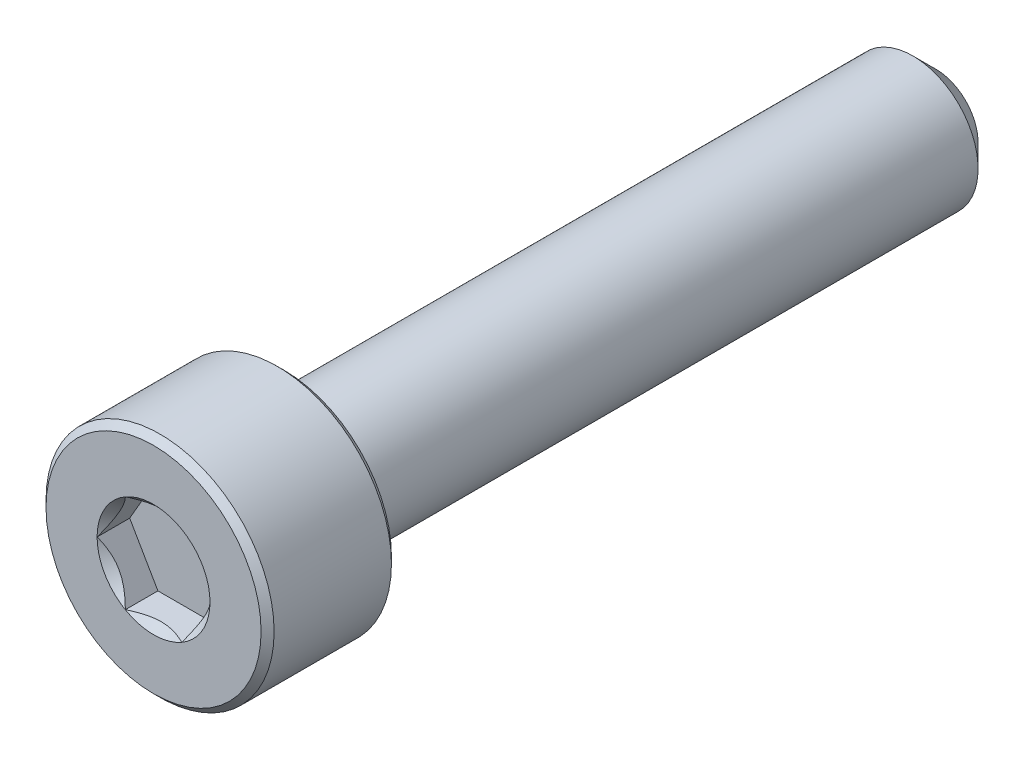
ISO-10303-21;
HEADER;
FILE_DESCRIPTION(('STEP AP214'),'2;1');
FILE_NAME('part.step','',(''),(''),'','','');
FILE_SCHEMA(('AUTOMOTIVE_DESIGN { 1 0 10303 214 1 1 1 1 }'));
ENDSEC;
DATA;
#1=APPLICATION_CONTEXT('core data for automotive mechanical design processes');
#2=APPLICATION_PROTOCOL_DEFINITION('international standard','automotive_design',2000,#1);
#3=PRODUCT_CONTEXT('',#1,'mechanical');
#4=PRODUCT('Part','Part','',(#3));
#5=PRODUCT_RELATED_PRODUCT_CATEGORY('part','',(#4));
#6=PRODUCT_DEFINITION_FORMATION('','',#4);
#7=PRODUCT_DEFINITION_CONTEXT('part definition',#1,'design');
#8=PRODUCT_DEFINITION('design','',#6,#7);
#9=PRODUCT_DEFINITION_SHAPE('','',#8);
#10=(LENGTH_UNIT() NAMED_UNIT(*) SI_UNIT(.MILLI.,.METRE.));
#11=(NAMED_UNIT(*) PLANE_ANGLE_UNIT() SI_UNIT($,.RADIAN.));
#12=(NAMED_UNIT(*) SI_UNIT($,.STERADIAN.) SOLID_ANGLE_UNIT());
#13=UNCERTAINTY_MEASURE_WITH_UNIT(LENGTH_MEASURE(1.E-05),#10,'distance_accuracy_value','');
#14=(GEOMETRIC_REPRESENTATION_CONTEXT(3) GLOBAL_UNCERTAINTY_ASSIGNED_CONTEXT((#13)) GLOBAL_UNIT_ASSIGNED_CONTEXT((#10,
#11,#12)) REPRESENTATION_CONTEXT('',''));
#15=CARTESIAN_POINT('',(0.,0.,0.));
#16=DIRECTION('',(0.,0.,1.));
#17=DIRECTION('',(1.,0.,0.));
#18=AXIS2_PLACEMENT_3D('',#15,#16,#17);
#19=CARTESIAN_POINT('',(0.,3.3,12.));
#20=DIRECTION('',(0.,0.,1.));
#21=DIRECTION('',(1.,0.,0.));
#22=AXIS2_PLACEMENT_3D('',#19,#20,#21);
#23=PLANE('',#22);
#24=CARTESIAN_POINT('',(0.,0.,12.));
#25=DIRECTION('',(0.,0.,1.));
#26=DIRECTION('',(1.,0.,0.));
#27=AXIS2_PLACEMENT_3D('',#24,#25,#26);
#28=CIRCLE('',#27,1.73205080756888);
#29=CARTESIAN_POINT('',(1.73205080756888,0.,12.));
#30=VERTEX_POINT('',#29);
#31=CARTESIAN_POINT('',(0.866025403784439,1.5,12.));
#32=VERTEX_POINT('',#31);
#33=EDGE_CURVE('E96',#30,#32,#28,.T.);
#34=ORIENTED_EDGE('',*,*,#33,.F.);
#35=CARTESIAN_POINT('',(0.866025403784438,-1.5,12.));
#36=VERTEX_POINT('',#35);
#37=EDGE_CURVE('E56',#36,#30,#28,.T.);
#38=ORIENTED_EDGE('',*,*,#37,.F.);
#39=CARTESIAN_POINT('',(-0.866025403784437,-1.5,12.));
#40=VERTEX_POINT('',#39);
#41=EDGE_CURVE('E299',#40,#36,#28,.T.);
#42=ORIENTED_EDGE('',*,*,#41,.F.);
#43=CARTESIAN_POINT('',(-1.73205080756888,0.,12.));
#44=VERTEX_POINT('',#43);
#45=EDGE_CURVE('E63',#44,#40,#28,.T.);
#46=ORIENTED_EDGE('',*,*,#45,.F.);
#47=CARTESIAN_POINT('',(-0.866025403784439,1.5,12.));
#48=VERTEX_POINT('',#47);
#49=EDGE_CURVE('E131',#48,#44,#28,.T.);
#50=ORIENTED_EDGE('',*,*,#49,.F.);
#51=EDGE_CURVE('E105',#32,#48,#28,.T.);
#52=ORIENTED_EDGE('',*,*,#51,.F.);
#53=EDGE_LOOP('',(#34,#38,#42,#46,#50,#52));
#54=FACE_BOUND('',#53,.T.);
#55=CARTESIAN_POINT('',(0.,0.,12.));
#56=DIRECTION('',(0.,0.,-1.));
#57=DIRECTION('',(-1.,0.,0.));
#58=AXIS2_PLACEMENT_3D('',#55,#56,#57);
#59=CIRCLE('',#58,3.3);
#60=CARTESIAN_POINT('',(-3.3,0.,12.));
#61=VERTEX_POINT('',#60);
#62=EDGE_CURVE('E50',#61,#61,#59,.T.);
#63=ORIENTED_EDGE('',*,*,#62,.F.);
#64=EDGE_LOOP('',(#63));
#65=FACE_BOUND('',#64,.T.);
#66=ADVANCED_FACE('F37',(#54,#65),#23,.T.);
#67=CARTESIAN_POINT('',(0.,0.,11.8));
#68=DIRECTION('',(0.,0.,-1.));
#69=DIRECTION('',(-1.,0.,0.));
#70=AXIS2_PLACEMENT_3D('',#67,#68,#69);
#71=CONICAL_SURFACE('',#70,3.5,0.785398163397453);
#72=ORIENTED_EDGE('',*,*,#62,.T.);
#73=EDGE_LOOP('',(#72));
#74=FACE_BOUND('',#73,.T.);
#75=CARTESIAN_POINT('',(0.,0.,11.8));
#76=DIRECTION('',(0.,0.,-1.));
#77=DIRECTION('',(-1.,0.,0.));
#78=AXIS2_PLACEMENT_3D('',#75,#76,#77);
#79=CIRCLE('',#78,3.5);
#80=CARTESIAN_POINT('',(-3.5,0.,11.8));
#81=VERTEX_POINT('',#80);
#82=EDGE_CURVE('E274',#81,#81,#79,.T.);
#83=ORIENTED_EDGE('',*,*,#82,.F.);
#84=EDGE_LOOP('',(#83));
#85=FACE_BOUND('',#84,.T.);
#86=ADVANCED_FACE('F195',(#74,#85),#71,.T.);
#87=CARTESIAN_POINT('',(0.,0.,-12.));
#88=DIRECTION('',(0.,0.,-1.));
#89=DIRECTION('',(-1.,0.,0.));
#90=AXIS2_PLACEMENT_3D('',#87,#88,#89);
#91=CYLINDRICAL_SURFACE('',#90,3.5);
#92=ORIENTED_EDGE('',*,*,#82,.T.);
#93=EDGE_LOOP('',(#92));
#94=FACE_BOUND('',#93,.T.);
#95=CARTESIAN_POINT('',(0.,0.,8.2));
#96=DIRECTION('',(0.,0.,-1.));
#97=DIRECTION('',(-1.,0.,0.));
#98=AXIS2_PLACEMENT_3D('',#95,#96,#97);
#99=CIRCLE('',#98,3.5);
#100=CARTESIAN_POINT('',(-3.5,0.,8.2));
#101=VERTEX_POINT('',#100);
#102=EDGE_CURVE('E271',#101,#101,#99,.T.);
#103=ORIENTED_EDGE('',*,*,#102,.F.);
#104=EDGE_LOOP('',(#103));
#105=FACE_BOUND('',#104,.T.);
#106=ADVANCED_FACE('F199',(#94,#105),#91,.T.);
#107=CARTESIAN_POINT('',(0.,0.,8.));
#108=DIRECTION('',(0.,0.,1.));
#109=DIRECTION('',(1.,0.,0.));
#110=AXIS2_PLACEMENT_3D('',#107,#108,#109);
#111=CONICAL_SURFACE('',#110,3.3,0.78539816339746);
#112=ORIENTED_EDGE('',*,*,#102,.T.);
#113=EDGE_LOOP('',(#112));
#114=FACE_BOUND('',#113,.T.);
#115=CARTESIAN_POINT('',(0.,0.,8.));
#116=DIRECTION('',(0.,0.,-1.));
#117=DIRECTION('',(-1.,0.,0.));
#118=AXIS2_PLACEMENT_3D('',#115,#116,#117);
#119=CIRCLE('',#118,3.3);
#120=CARTESIAN_POINT('',(-3.3,0.,8.));
#121=VERTEX_POINT('',#120);
#122=EDGE_CURVE('E268',#121,#121,#119,.T.);
#123=ORIENTED_EDGE('',*,*,#122,.F.);
#124=EDGE_LOOP('',(#123));
#125=FACE_BOUND('',#124,.T.);
#126=ADVANCED_FACE('F204',(#114,#125),#111,.T.);
#127=CARTESIAN_POINT('',(0.,3.3,8.));
#128=DIRECTION('',(0.,0.,-1.));
#129=DIRECTION('',(-1.,0.,0.));
#130=AXIS2_PLACEMENT_3D('',#127,#128,#129);
#131=PLANE('',#130);
#132=ORIENTED_EDGE('',*,*,#122,.T.);
#133=EDGE_LOOP('',(#132));
#134=FACE_BOUND('',#133,.T.);
#135=CARTESIAN_POINT('',(0.,0.,8.));
#136=DIRECTION('',(0.,0.,-1.));
#137=DIRECTION('',(-1.,0.,0.));
#138=AXIS2_PLACEMENT_3D('',#135,#136,#137);
#139=CIRCLE('',#138,2.);
#140=CARTESIAN_POINT('',(-2.,0.,8.));
#141=VERTEX_POINT('',#140);
#142=EDGE_CURVE('E265',#141,#141,#139,.T.);
#143=ORIENTED_EDGE('',*,*,#142,.F.);
#144=EDGE_LOOP('',(#143));
#145=FACE_BOUND('',#144,.T.);
#146=ADVANCED_FACE('F212',(#134,#145),#131,.T.);
#147=CARTESIAN_POINT('',(0.,0.,-12.));
#148=DIRECTION('',(0.,0.,-1.));
#149=DIRECTION('',(-1.,0.,0.));
#150=AXIS2_PLACEMENT_3D('',#147,#148,#149);
#151=CYLINDRICAL_SURFACE('',#150,2.);
#152=ORIENTED_EDGE('',*,*,#142,.T.);
#153=EDGE_LOOP('',(#152));
#154=FACE_BOUND('',#153,.T.);
#155=CARTESIAN_POINT('',(0.,0.,-11.3));
#156=DIRECTION('',(0.,0.,-1.));
#157=DIRECTION('',(-1.,0.,0.));
#158=AXIS2_PLACEMENT_3D('',#155,#156,#157);
#159=CIRCLE('',#158,2.);
#160=CARTESIAN_POINT('',(-2.,0.,-11.3));
#161=VERTEX_POINT('',#160);
#162=EDGE_CURVE('E262',#161,#161,#159,.T.);
#163=ORIENTED_EDGE('',*,*,#162,.F.);
#164=EDGE_LOOP('',(#163));
#165=FACE_BOUND('',#164,.T.);
#166=ADVANCED_FACE('F216',(#154,#165),#151,.T.);
#167=CARTESIAN_POINT('',(0.,0.,-12.));
#168=DIRECTION('',(0.,0.,1.));
#169=DIRECTION('',(1.,0.,0.));
#170=AXIS2_PLACEMENT_3D('',#167,#168,#169);
#171=CONICAL_SURFACE('',#170,1.3,0.785398163397442);
#172=ORIENTED_EDGE('',*,*,#162,.T.);
#173=EDGE_LOOP('',(#172));
#174=FACE_BOUND('',#173,.T.);
#175=CARTESIAN_POINT('',(0.,0.,-12.));
#176=DIRECTION('',(0.,0.,-1.));
#177=DIRECTION('',(-1.,0.,0.));
#178=AXIS2_PLACEMENT_3D('',#175,#176,#177);
#179=CIRCLE('',#178,1.3);
#180=CARTESIAN_POINT('',(-1.3,0.,-12.));
#181=VERTEX_POINT('',#180);
#182=EDGE_CURVE('E244',#181,#181,#179,.T.);
#183=ORIENTED_EDGE('',*,*,#182,.F.);
#184=EDGE_LOOP('',(#183));
#185=FACE_BOUND('',#184,.T.);
#186=ADVANCED_FACE('F220',(#174,#185),#171,.T.);
#187=CARTESIAN_POINT('',(0.,1.3,-12.));
#188=DIRECTION('',(0.,0.,-1.));
#189=DIRECTION('',(-1.,0.,0.));
#190=AXIS2_PLACEMENT_3D('',#187,#188,#189);
#191=PLANE('',#190);
#192=ORIENTED_EDGE('',*,*,#182,.T.);
#193=EDGE_LOOP('',(#192));
#194=FACE_BOUND('',#193,.T.);
#195=ADVANCED_FACE('F224',(#194),#191,.T.);
#196=CARTESIAN_POINT('',(0.,0.,12.));
#197=DIRECTION('',(0.,0.,1.));
#198=DIRECTION('',(1.,0.,0.));
#199=AXIS2_PLACEMENT_3D('',#196,#197,#198);
#200=CONICAL_SURFACE('',#199,1.73205080756888,0.78539816339745);
#201=ORIENTED_EDGE('',*,*,#51,.T.);
#202=CARTESIAN_POINT('',(-1.70094076506827,1.5,12.5358115088584));
#203=CARTESIAN_POINT('',(-1.65940339782208,1.5,12.5046624531024));
#204=CARTESIAN_POINT('',(-1.61763176078228,1.5,12.4738266455959));
#205=CARTESIAN_POINT('',(-1.53352581654145,1.5,12.4129100577648));
#206=CARTESIAN_POINT('',(-1.49119136803515,1.5,12.382829472747));
#207=CARTESIAN_POINT('',(-1.36258344452521,1.5,12.293484829301));
#208=CARTESIAN_POINT('',(-1.2753370594297,1.5,12.2355978131923));
#209=CARTESIAN_POINT('',(-1.09255216856664,1.5,12.1221956740766));
#210=CARTESIAN_POINT('',(-0.996821581472453,1.5,12.0669865473912));
#211=CARTESIAN_POINT('',(-0.800613082053124,1.5,11.9661637893348));
#212=CARTESIAN_POINT('',(-0.700152604671769,1.5,11.9205178517016));
#213=CARTESIAN_POINT('',(-0.549105960667006,1.5,11.8646825296453));
#214=CARTESIAN_POINT('',(-0.500700743459033,1.5,11.8486143922722));
#215=CARTESIAN_POINT('',(-0.402744694879906,1.5,11.8203677224624));
#216=CARTESIAN_POINT('',(-0.353193782638679,1.5,11.8081894655014));
#217=CARTESIAN_POINT('',(-0.254057869184596,1.5,11.7885509139489));
#218=CARTESIAN_POINT('',(-0.204488814343416,1.5,11.7810113615502));
#219=CARTESIAN_POINT('',(-0.104849462338083,1.5,11.7707932169081));
#220=CARTESIAN_POINT('',(-0.0547792472716358,1.5,11.7681138411859));
#221=CARTESIAN_POINT('',(0.043673723240303,1.5,11.767804626871));
#222=CARTESIAN_POINT('',(0.0920560167539032,1.5,11.7700063307466));
#223=CARTESIAN_POINT('',(0.188397733587633,1.5,11.7789725882818));
#224=CARTESIAN_POINT('',(0.236357072410825,1.5,11.7857380336531));
#225=CARTESIAN_POINT('',(0.332310054343575,1.5,11.8035816391));
#226=CARTESIAN_POINT('',(0.380290051435319,1.5,11.8147320968888));
#227=CARTESIAN_POINT('',(0.475204867138459,1.5,11.8407610620092));
#228=CARTESIAN_POINT('',(0.522139781644104,1.5,11.8556392257479));
#229=CARTESIAN_POINT('',(0.671135849783409,1.5,11.9084343929006));
#230=CARTESIAN_POINT('',(0.77104370903169,1.5,11.9524144967216));
#231=CARTESIAN_POINT('',(0.966154321560161,1.5,12.0501619485856));
#232=CARTESIAN_POINT('',(1.06133841113756,1.5,12.103964710995));
#233=CARTESIAN_POINT('',(1.24322962223427,1.5,12.214924266983));
#234=CARTESIAN_POINT('',(1.33012275433518,1.5,12.2717798891689));
#235=CARTESIAN_POINT('',(1.45814294649102,1.5,12.359655740629));
#236=CARTESIAN_POINT('',(1.50026316243668,1.5,12.3892542444644));
#237=CARTESIAN_POINT('',(1.58392901903633,1.5,12.4492295734326));
#238=CARTESIAN_POINT('',(1.62547481325447,1.5,12.4796061841021));
#239=CARTESIAN_POINT('',(1.66678158715899,1.5,12.5103052879905));
#240=B_SPLINE_CURVE_WITH_KNOTS('',3,(#202,#203,#204,#205,#206,#207,#208,#209,#210,#211,#212,
#213,#214,#215,#216,#217,#218,#219,#220,#221,#222,#223,#224,#225,#226,#227,#228,#229,#230,#231,
#232,#233,#234,#235,#236,#237,#238,#239),.UNSPECIFIED.,.F.,.F.,(4,2,2,2,2,2,2,2,2,2,2,2,2,2,2,2,
2,2,4),(0.,0.155753948125308,0.311547769047943,0.625513832104915,0.95676361417602,
1.28687565529454,1.43975300083937,1.59264117053357,1.74283872208071,1.89301205906115,
2.03808349408246,2.18318328289585,2.33078307406584,2.47836926555587,2.80488410158167,
3.13260026737189,3.44396956489968,3.59840353570064,3.75279538962595),.UNSPECIFIED.);
#241=EDGE_CURVE('E12',#32,#48,#240,.F.);
#242=ORIENTED_EDGE('',*,*,#241,.F.);
#243=EDGE_LOOP('',(#201,#242));
#244=FACE_BOUND('',#243,.T.);
#245=ADVANCED_FACE('F109',(#244),#200,.F.);
#246=ORIENTED_EDGE('',*,*,#49,.T.);
#247=CARTESIAN_POINT('',(-0.865909933730601,1.5002,12.0001154816001));
#248=CARTESIAN_POINT('',(-0.895682611594166,1.44863220926292,11.9703654760673));
#249=CARTESIAN_POINT('',(-0.925953159489765,1.3962020823348,11.9423624839103));
#250=CARTESIAN_POINT('',(-0.987678321317123,1.2892909659444,11.8910892304401));
#251=CARTESIAN_POINT('',(-1.01913880822717,1.23479980418534,11.8678475050444));
#252=CARTESIAN_POINT('',(-1.08257741237344,1.12492091864275,11.8280337289922));
#253=CARTESIAN_POINT('',(-1.11453936608521,1.0695611909048,11.8113615856709));
#254=CARTESIAN_POINT('',(-1.1791670593912,0.957622742522849,11.7856744568181));
#255=CARTESIAN_POINT('',(-1.21183082354213,0.901047443446991,11.7766402904789));
#256=CARTESIAN_POINT('',(-1.26812411040032,0.803544610483558,11.7684890812269));
#257=CARTESIAN_POINT('',(-1.29168087824208,0.762743091719533,11.7672822529892));
#258=CARTESIAN_POINT('',(-1.33875285845138,0.681212030384141,11.7693140571623));
#259=CARTESIAN_POINT('',(-1.36226806050018,0.640482505685369,11.7725536707483));
#260=CARTESIAN_POINT('',(-1.40907206156905,0.559415597836583,11.783291985982));
#261=CARTESIAN_POINT('',(-1.43236062923612,0.519078615401711,11.7907946530187));
#262=CARTESIAN_POINT('',(-1.47854689118996,0.439081663085968,11.8096516119283));
#263=CARTESIAN_POINT('',(-1.50144441326545,0.399421991483791,11.8210075570186));
#264=CARTESIAN_POINT('',(-1.56009461325633,0.297836865225514,11.8547216475927));
#265=CARTESIAN_POINT('',(-1.59548353987866,0.23654144629031,11.8796218490934));
#266=CARTESIAN_POINT('',(-1.64751843074894,0.146414371536686,11.9216566532716));
#267=CARTESIAN_POINT('',(-1.66466545167617,0.116714860092282,11.9364251535591));
#268=CARTESIAN_POINT('',(-1.69864410935691,0.0578620986162494,11.9673105659402));
#269=CARTESIAN_POINT('',(-1.71547589206761,0.0287085957793632,11.9834268341217));
#270=CARTESIAN_POINT('',(-1.73216627762271,-0.000199999999999347,12.0001154816001));
#271=B_SPLINE_CURVE_WITH_KNOTS('',3,(#247,#248,#249,#250,#251,#252,#253,#254,#255,#256,#257,
#258,#259,#260,#261,#262,#263,#264,#265,#266,#267,#268,#269,#270),.UNSPECIFIED.,.F.,.F.,(4,2,2,
2,2,2,2,2,2,2,2,4),(0.,0.199829143693305,0.400822987382388,0.598623720538181,0.79592624018889,
0.937113067959881,1.07833105577193,1.21968061668222,1.36109089931054,1.58570969637565,
1.69770705470963,1.80965120737194),.UNSPECIFIED.);
#272=EDGE_CURVE('E104',#48,#44,#271,.T.);
#273=ORIENTED_EDGE('',*,*,#272,.F.);
#274=EDGE_LOOP('',(#246,#273));
#275=FACE_BOUND('',#274,.T.);
#276=ADVANCED_FACE('F307',(#275),#200,.F.);
#277=ORIENTED_EDGE('',*,*,#45,.T.);
#278=CARTESIAN_POINT('',(-1.73216627762271,0.000200000000000104,12.0001154816001));
#279=CARTESIAN_POINT('',(-1.70239359975915,-0.0513677907370752,11.9703654760673));
#280=CARTESIAN_POINT('',(-1.67212305186355,-0.1037979176652,11.9423624839103));
#281=CARTESIAN_POINT('',(-1.61039789003619,-0.210709034055596,11.8910892304401));
#282=CARTESIAN_POINT('',(-1.57893740312614,-0.26520019581466,11.8678475050444));
#283=CARTESIAN_POINT('',(-1.51549879897987,-0.375079081357248,11.8280337289922));
#284=CARTESIAN_POINT('',(-1.4835368452681,-0.430438809095199,11.8113615856709));
#285=CARTESIAN_POINT('',(-1.41890915196211,-0.54237725747715,11.7856744568181));
#286=CARTESIAN_POINT('',(-1.38624538781118,-0.598952556553007,11.7766402904789));
#287=CARTESIAN_POINT('',(-1.32995210095299,-0.696455389516439,11.7684890812269));
#288=CARTESIAN_POINT('',(-1.30639533311124,-0.737256908280465,11.7672822529892));
#289=CARTESIAN_POINT('',(-1.25932335290193,-0.818787969615857,11.7693140571623));
#290=CARTESIAN_POINT('',(-1.23580815085313,-0.859517494314628,11.7725536707483));
#291=CARTESIAN_POINT('',(-1.18900414978427,-0.940584402163414,11.783291985982));
#292=CARTESIAN_POINT('',(-1.1657155821172,-0.980921384598286,11.7907946530187));
#293=CARTESIAN_POINT('',(-1.11952932016335,-1.06091833691403,11.8096516119283));
#294=CARTESIAN_POINT('',(-1.09663179808786,-1.10057800851621,11.8210075570186));
#295=CARTESIAN_POINT('',(-1.03798159809698,-1.20216313477448,11.8547216475927));
#296=CARTESIAN_POINT('',(-1.00259267147465,-1.26345855370969,11.8796218490934));
#297=CARTESIAN_POINT('',(-0.950557780604374,-1.35358562846331,11.9216566532716));
#298=CARTESIAN_POINT('',(-0.933410759677147,-1.38328513990772,11.9364251535591));
#299=CARTESIAN_POINT('',(-0.899432101996406,-1.44213790138375,11.9673105659402));
#300=CARTESIAN_POINT('',(-0.882600319285709,-1.47129140422064,11.9834268341217));
#301=CARTESIAN_POINT('',(-0.8659099337306,-1.5002,12.0001154816001));
#302=B_SPLINE_CURVE_WITH_KNOTS('',3,(#278,#279,#280,#281,#282,#283,#284,#285,#286,#287,#288,
#289,#290,#291,#292,#293,#294,#295,#296,#297,#298,#299,#300,#301),.UNSPECIFIED.,.F.,.F.,(4,2,2,
2,2,2,2,2,2,2,2,4),(0.,0.199829143693304,0.400822987382388,0.59862372053818,0.795926240188888,
0.93711306795988,1.07833105577193,1.21968061668222,1.36109089931054,1.58570969637565,
1.69770705470964,1.80965120737194),.UNSPECIFIED.);
#303=EDGE_CURVE('E140',#44,#40,#302,.T.);
#304=ORIENTED_EDGE('',*,*,#303,.F.);
#305=EDGE_LOOP('',(#277,#304));
#306=FACE_BOUND('',#305,.T.);
#307=ADVANCED_FACE('F302',(#306),#200,.F.);
#308=ORIENTED_EDGE('',*,*,#41,.T.);
#309=CARTESIAN_POINT('',(-1.70094076506827,-1.5,12.5358115088584));
#310=CARTESIAN_POINT('',(-1.65940339782208,-1.5,12.5046624531024));
#311=CARTESIAN_POINT('',(-1.61763176078228,-1.5,12.4738266455959));
#312=CARTESIAN_POINT('',(-1.53352581654145,-1.5,12.4129100577648));
#313=CARTESIAN_POINT('',(-1.49119136803515,-1.5,12.382829472747));
#314=CARTESIAN_POINT('',(-1.36258344452521,-1.5,12.293484829301));
#315=CARTESIAN_POINT('',(-1.2753370594297,-1.5,12.2355978131923));
#316=CARTESIAN_POINT('',(-1.09255216856664,-1.5,12.1221956740766));
#317=CARTESIAN_POINT('',(-0.996821581472453,-1.5,12.0669865473912));
#318=CARTESIAN_POINT('',(-0.800613082053125,-1.5,11.9661637893348));
#319=CARTESIAN_POINT('',(-0.700152604671769,-1.5,11.9205178517016));
#320=CARTESIAN_POINT('',(-0.549105960667006,-1.5,11.8646825296453));
#321=CARTESIAN_POINT('',(-0.500700743459033,-1.5,11.8486143922722));
#322=CARTESIAN_POINT('',(-0.402744694879906,-1.5,11.8203677224624));
#323=CARTESIAN_POINT('',(-0.353193782638679,-1.5,11.8081894655014));
#324=CARTESIAN_POINT('',(-0.254057869184595,-1.5,11.7885509139489));
#325=CARTESIAN_POINT('',(-0.204488814343416,-1.5,11.7810113615502));
#326=CARTESIAN_POINT('',(-0.104849462338082,-1.5,11.7707932169081));
#327=CARTESIAN_POINT('',(-0.0547792472716353,-1.5,11.7681138411859));
#328=CARTESIAN_POINT('',(0.0436737232403033,-1.5,11.767804626871));
#329=CARTESIAN_POINT('',(0.0920560167539034,-1.5,11.7700063307466));
#330=CARTESIAN_POINT('',(0.188397733587633,-1.5,11.7789725882818));
#331=CARTESIAN_POINT('',(0.236357072410825,-1.5,11.7857380336531));
#332=CARTESIAN_POINT('',(0.332310054343576,-1.5,11.8035816391));
#333=CARTESIAN_POINT('',(0.380290051435319,-1.5,11.8147320968888));
#334=CARTESIAN_POINT('',(0.475204867138459,-1.5,11.8407610620092));
#335=CARTESIAN_POINT('',(0.522139781644105,-1.5,11.8556392257479));
#336=CARTESIAN_POINT('',(0.671135849783409,-1.5,11.9084343929006));
#337=CARTESIAN_POINT('',(0.77104370903169,-1.5,11.9524144967216));
#338=CARTESIAN_POINT('',(0.966154321560161,-1.5,12.0501619485856));
#339=CARTESIAN_POINT('',(1.06133841113756,-1.5,12.103964710995));
#340=CARTESIAN_POINT('',(1.24322962223427,-1.5,12.214924266983));
#341=CARTESIAN_POINT('',(1.33012275433519,-1.5,12.2717798891689));
#342=CARTESIAN_POINT('',(1.45814294649102,-1.5,12.359655740629));
#343=CARTESIAN_POINT('',(1.50026316243668,-1.5,12.3892542444644));
#344=CARTESIAN_POINT('',(1.58392901903633,-1.5,12.4492295734326));
#345=CARTESIAN_POINT('',(1.62547481325447,-1.5,12.4796061841021));
#346=CARTESIAN_POINT('',(1.66678158715899,-1.5,12.5103052879905));
#347=B_SPLINE_CURVE_WITH_KNOTS('',3,(#309,#310,#311,#312,#313,#314,#315,#316,#317,#318,#319,
#320,#321,#322,#323,#324,#325,#326,#327,#328,#329,#330,#331,#332,#333,#334,#335,#336,#337,#338,
#339,#340,#341,#342,#343,#344,#345,#346),.UNSPECIFIED.,.F.,.F.,(4,2,2,2,2,2,2,2,2,2,2,2,2,2,2,2,
2,2,4),(0.,0.155753948125309,0.311547769047943,0.625513832104917,0.956763614176022,
1.28687565529455,1.43975300083937,1.59264117053357,1.74283872208071,1.89301205906115,
2.03808349408246,2.18318328289585,2.33078307406584,2.47836926555587,2.80488410158167,
3.1326002673719,3.44396956489969,3.59840353570064,3.75279538962596),.UNSPECIFIED.);
#348=EDGE_CURVE('E160',#40,#36,#347,.T.);
#349=ORIENTED_EDGE('',*,*,#348,.F.);
#350=EDGE_LOOP('',(#308,#349));
#351=FACE_BOUND('',#350,.T.);
#352=ADVANCED_FACE('F300',(#351),#200,.F.);
#353=ORIENTED_EDGE('',*,*,#37,.T.);
#354=CARTESIAN_POINT('',(0.865909933730601,-1.5002,12.0001154816001));
#355=CARTESIAN_POINT('',(0.895682611594165,-1.44863220926292,11.9703654760673));
#356=CARTESIAN_POINT('',(0.925953159489765,-1.3962020823348,11.9423624839103));
#357=CARTESIAN_POINT('',(0.987678321317123,-1.2892909659444,11.8910892304401));
#358=CARTESIAN_POINT('',(1.01913880822717,-1.23479980418534,11.8678475050444));
#359=CARTESIAN_POINT('',(1.08257741237344,-1.12492091864275,11.8280337289922));
#360=CARTESIAN_POINT('',(1.11453936608521,-1.0695611909048,11.8113615856709));
#361=CARTESIAN_POINT('',(1.1791670593912,-0.95762274252285,11.7856744568181));
#362=CARTESIAN_POINT('',(1.21183082354213,-0.901047443446992,11.7766402904789));
#363=CARTESIAN_POINT('',(1.26812411040032,-0.80354461048356,11.7684890812269));
#364=CARTESIAN_POINT('',(1.29168087824208,-0.762743091719535,11.7672822529892));
#365=CARTESIAN_POINT('',(1.33875285845138,-0.681212030384143,11.7693140571623));
#366=CARTESIAN_POINT('',(1.36226806050018,-0.640482505685371,11.7725536707483));
#367=CARTESIAN_POINT('',(1.40907206156905,-0.559415597836585,11.783291985982));
#368=CARTESIAN_POINT('',(1.43236062923612,-0.519078615401713,11.7907946530187));
#369=CARTESIAN_POINT('',(1.47854689118996,-0.43908166308597,11.8096516119283));
#370=CARTESIAN_POINT('',(1.50144441326545,-0.399421991483794,11.8210075570186));
#371=CARTESIAN_POINT('',(1.56009461325633,-0.297836865225516,11.8547216475927));
#372=CARTESIAN_POINT('',(1.59548353987866,-0.236541446290312,11.8796218490934));
#373=CARTESIAN_POINT('',(1.64751843074894,-0.146414371536687,11.9216566532716));
#374=CARTESIAN_POINT('',(1.66466545167617,-0.116714860092283,11.9364251535591));
#375=CARTESIAN_POINT('',(1.69864410935691,-0.0578620986162491,11.9673105659402));
#376=CARTESIAN_POINT('',(1.71547589206761,-0.0287085957793626,11.9834268341217));
#377=CARTESIAN_POINT('',(1.73216627762272,0.000200000000000241,12.0001154816001));
#378=B_SPLINE_CURVE_WITH_KNOTS('',3,(#354,#355,#356,#357,#358,#359,#360,#361,#362,#363,#364,
#365,#366,#367,#368,#369,#370,#371,#372,#373,#374,#375,#376,#377),.UNSPECIFIED.,.F.,.F.,(4,2,2,
2,2,2,2,2,2,2,2,4),(0.,0.199829143693304,0.400822987382387,0.598623720538179,0.795926240188887,
0.937113067959879,1.07833105577193,1.21968061668222,1.36109089931054,1.58570969637565,
1.69770705470963,1.80965120737194),.UNSPECIFIED.);
#379=EDGE_CURVE('E121',#36,#30,#378,.T.);
#380=ORIENTED_EDGE('',*,*,#379,.F.);
#381=EDGE_LOOP('',(#353,#380));
#382=FACE_BOUND('',#381,.T.);
#383=ADVANCED_FACE('F153',(#382),#200,.F.);
#384=ORIENTED_EDGE('',*,*,#33,.T.);
#385=CARTESIAN_POINT('',(1.73216627762272,-0.000200000000000158,12.0001154816001));
#386=CARTESIAN_POINT('',(1.70239359975915,0.0513677907370755,11.9703654760673));
#387=CARTESIAN_POINT('',(1.67212305186355,0.103797917665201,11.9423624839103));
#388=CARTESIAN_POINT('',(1.61039789003619,0.210709034055597,11.8910892304401));
#389=CARTESIAN_POINT('',(1.57893740312614,0.265200195814661,11.8678475050444));
#390=CARTESIAN_POINT('',(1.51549879897987,0.375079081357249,11.8280337289922));
#391=CARTESIAN_POINT('',(1.4835368452681,0.4304388090952,11.8113615856709));
#392=CARTESIAN_POINT('',(1.41890915196211,0.542377257477151,11.7856744568181));
#393=CARTESIAN_POINT('',(1.38624538781118,0.598952556553009,11.7766402904789));
#394=CARTESIAN_POINT('',(1.32995210095299,0.696455389516441,11.7684890812269));
#395=CARTESIAN_POINT('',(1.30639533311124,0.737256908280466,11.7672822529892));
#396=CARTESIAN_POINT('',(1.25932335290193,0.818787969615858,11.7693140571623));
#397=CARTESIAN_POINT('',(1.23580815085313,0.85951749431463,11.7725536707483));
#398=CARTESIAN_POINT('',(1.18900414978427,0.940584402163416,11.783291985982));
#399=CARTESIAN_POINT('',(1.16571558211719,0.980921384598288,11.7907946530187));
#400=CARTESIAN_POINT('',(1.11952932016335,1.06091833691403,11.8096516119283));
#401=CARTESIAN_POINT('',(1.09663179808786,1.10057800851621,11.8210075570186));
#402=CARTESIAN_POINT('',(1.03798159809698,1.20216313477449,11.8547216475927));
#403=CARTESIAN_POINT('',(1.00259267147465,1.26345855370969,11.8796218490934));
#404=CARTESIAN_POINT('',(0.950557780604374,1.35358562846331,11.9216566532716));
#405=CARTESIAN_POINT('',(0.933410759677147,1.38328513990772,11.9364251535591));
#406=CARTESIAN_POINT('',(0.899432101996406,1.44213790138375,11.9673105659402));
#407=CARTESIAN_POINT('',(0.88260031928571,1.47129140422064,11.9834268341217));
#408=CARTESIAN_POINT('',(0.8659099337306,1.5002,12.0001154816001));
#409=B_SPLINE_CURVE_WITH_KNOTS('',3,(#385,#386,#387,#388,#389,#390,#391,#392,#393,#394,#395,
#396,#397,#398,#399,#400,#401,#402,#403,#404,#405,#406,#407,#408),.UNSPECIFIED.,.F.,.F.,(4,2,2,
2,2,2,2,2,2,2,2,4),(0.,0.199829143693305,0.40082298738239,0.598623720538182,0.79592624018889,
0.937113067959882,1.07833105577193,1.21968061668222,1.36109089931055,1.58570969637566,
1.69770705470964,1.80965120737194),.UNSPECIFIED.);
#410=EDGE_CURVE('E100',#30,#32,#409,.T.);
#411=ORIENTED_EDGE('',*,*,#410,.F.);
#412=EDGE_LOOP('',(#384,#411));
#413=FACE_BOUND('',#412,.T.);
#414=ADVANCED_FACE('F98',(#413),#200,.F.);
#415=CARTESIAN_POINT('',(0.,3.3,11.));
#416=DIRECTION('',(0.,0.,1.));
#417=DIRECTION('',(1.,0.,0.));
#418=AXIS2_PLACEMENT_3D('',#415,#416,#417);
#419=PLANE('',#418);
#420=DIRECTION('',(0.5,-0.866025403784439,0.));
#421=VECTOR('',#420,1.);
#422=CARTESIAN_POINT('',(1.73205080756888,0.,11.));
#423=LINE('',#422,#421);
#424=CARTESIAN_POINT('',(0.866025403784438,1.5,11.));
#425=VERTEX_POINT('',#424);
#426=CARTESIAN_POINT('',(1.73205080756888,0.,11.));
#427=VERTEX_POINT('',#426);
#428=EDGE_CURVE('E239',#425,#427,#423,.T.);
#429=ORIENTED_EDGE('',*,*,#428,.F.);
#430=DIRECTION('',(1.,0.,0.));
#431=VECTOR('',#430,1.);
#432=CARTESIAN_POINT('',(0.866025403784438,1.5,11.));
#433=LINE('',#432,#431);
#434=CARTESIAN_POINT('',(-0.866025403784438,1.5,11.));
#435=VERTEX_POINT('',#434);
#436=EDGE_CURVE('E125',#435,#425,#433,.T.);
#437=ORIENTED_EDGE('',*,*,#436,.F.);
#438=DIRECTION('',(0.5,0.866025403784439,0.));
#439=VECTOR('',#438,1.);
#440=CARTESIAN_POINT('',(-0.866025403784438,1.5,11.));
#441=LINE('',#440,#439);
#442=CARTESIAN_POINT('',(-1.73205080756888,0.,11.));
#443=VERTEX_POINT('',#442);
#444=EDGE_CURVE('E251',#443,#435,#441,.T.);
#445=ORIENTED_EDGE('',*,*,#444,.F.);
#446=DIRECTION('',(-0.5,0.866025403784439,0.));
#447=VECTOR('',#446,1.);
#448=CARTESIAN_POINT('',(-1.73205080756888,0.,11.));
#449=LINE('',#448,#447);
#450=CARTESIAN_POINT('',(-0.866025403784438,-1.5,11.));
#451=VERTEX_POINT('',#450);
#452=EDGE_CURVE('E290',#451,#443,#449,.T.);
#453=ORIENTED_EDGE('',*,*,#452,.F.);
#454=DIRECTION('',(-1.,0.,0.));
#455=VECTOR('',#454,1.);
#456=CARTESIAN_POINT('',(-0.866025403784438,-1.5,11.));
#457=LINE('',#456,#455);
#458=CARTESIAN_POINT('',(0.866025403784438,-1.5,11.));
#459=VERTEX_POINT('',#458);
#460=EDGE_CURVE('E246',#459,#451,#457,.T.);
#461=ORIENTED_EDGE('',*,*,#460,.F.);
#462=DIRECTION('',(-0.5,-0.866025403784439,0.));
#463=VECTOR('',#462,1.);
#464=CARTESIAN_POINT('',(0.866025403784438,-1.5,11.));
#465=LINE('',#464,#463);
#466=EDGE_CURVE('E242',#427,#459,#465,.T.);
#467=ORIENTED_EDGE('',*,*,#466,.F.);
#468=EDGE_LOOP('',(#429,#437,#445,#453,#461,#467));
#469=FACE_BOUND('',#468,.T.);
#470=ADVANCED_FACE('F152',(#469),#419,.T.);
#471=CARTESIAN_POINT('',(0.866025403784438,1.5,5.41742430504416));
#472=DIRECTION('',(0.,1.,0.));
#473=DIRECTION('',(-1.,0.,0.));
#474=AXIS2_PLACEMENT_3D('',#471,#472,#473);
#475=PLANE('',#474);
#476=DIRECTION('',(0.,0.,1.));
#477=VECTOR('',#476,1.);
#478=CARTESIAN_POINT('',(0.866025403784438,1.5,5.41742430504416));
#479=LINE('',#478,#477);
#480=EDGE_CURVE('E118',#425,#32,#479,.T.);
#481=ORIENTED_EDGE('',*,*,#480,.T.);
#482=ORIENTED_EDGE('',*,*,#241,.T.);
#483=DIRECTION('',(0.,0.,1.));
#484=VECTOR('',#483,1.);
#485=CARTESIAN_POINT('',(-0.866025403784438,1.5,5.41742430504416));
#486=LINE('',#485,#484);
#487=EDGE_CURVE('E127',#435,#48,#486,.T.);
#488=ORIENTED_EDGE('',*,*,#487,.F.);
#489=ORIENTED_EDGE('',*,*,#436,.T.);
#490=EDGE_LOOP('',(#481,#482,#488,#489));
#491=FACE_BOUND('',#490,.T.);
#492=ADVANCED_FACE('F123',(#491),#475,.F.);
#493=CARTESIAN_POINT('',(-0.866025403784438,1.5,5.41742430504416));
#494=DIRECTION('',(-0.866025403784439,0.5,0.));
#495=DIRECTION('',(-0.5,-0.866025403784439,0.));
#496=AXIS2_PLACEMENT_3D('',#493,#494,#495);
#497=PLANE('',#496);
#498=ORIENTED_EDGE('',*,*,#487,.T.);
#499=ORIENTED_EDGE('',*,*,#272,.T.);
#500=DIRECTION('',(0.,0.,1.));
#501=VECTOR('',#500,1.);
#502=CARTESIAN_POINT('',(-1.73205080756888,0.,5.41742430504416));
#503=LINE('',#502,#501);
#504=EDGE_CURVE('E257',#443,#44,#503,.T.);
#505=ORIENTED_EDGE('',*,*,#504,.F.);
#506=ORIENTED_EDGE('',*,*,#444,.T.);
#507=EDGE_LOOP('',(#498,#499,#505,#506));
#508=FACE_BOUND('',#507,.T.);
#509=ADVANCED_FACE('F147',(#508),#497,.F.);
#510=CARTESIAN_POINT('',(-1.73205080756888,0.,5.41742430504416));
#511=DIRECTION('',(-0.866025403784439,-0.5,0.));
#512=DIRECTION('',(0.5,-0.866025403784439,0.));
#513=AXIS2_PLACEMENT_3D('',#510,#511,#512);
#514=PLANE('',#513);
#515=ORIENTED_EDGE('',*,*,#504,.T.);
#516=ORIENTED_EDGE('',*,*,#303,.T.);
#517=DIRECTION('',(0.,0.,1.));
#518=VECTOR('',#517,1.);
#519=CARTESIAN_POINT('',(-0.866025403784438,-1.5,5.41742430504416));
#520=LINE('',#519,#518);
#521=EDGE_CURVE('E254',#451,#40,#520,.T.);
#522=ORIENTED_EDGE('',*,*,#521,.F.);
#523=ORIENTED_EDGE('',*,*,#452,.T.);
#524=EDGE_LOOP('',(#515,#516,#522,#523));
#525=FACE_BOUND('',#524,.T.);
#526=ADVANCED_FACE('F184',(#525),#514,.F.);
#527=CARTESIAN_POINT('',(-0.866025403784438,-1.5,5.41742430504416));
#528=DIRECTION('',(0.,-1.,0.));
#529=DIRECTION('',(0.,0.,-1.));
#530=AXIS2_PLACEMENT_3D('',#527,#528,#529);
#531=PLANE('',#530);
#532=ORIENTED_EDGE('',*,*,#521,.T.);
#533=ORIENTED_EDGE('',*,*,#348,.T.);
#534=DIRECTION('',(0.,0.,1.));
#535=VECTOR('',#534,1.);
#536=CARTESIAN_POINT('',(0.866025403784438,-1.5,5.41742430504416));
#537=LINE('',#536,#535);
#538=EDGE_CURVE('E252',#459,#36,#537,.T.);
#539=ORIENTED_EDGE('',*,*,#538,.F.);
#540=ORIENTED_EDGE('',*,*,#460,.T.);
#541=EDGE_LOOP('',(#532,#533,#539,#540));
#542=FACE_BOUND('',#541,.T.);
#543=ADVANCED_FACE('F180',(#542),#531,.F.);
#544=CARTESIAN_POINT('',(0.866025403784438,-1.5,5.41742430504416));
#545=DIRECTION('',(0.866025403784438,-0.5,0.));
#546=DIRECTION('',(0.5,0.866025403784439,0.));
#547=AXIS2_PLACEMENT_3D('',#544,#545,#546);
#548=PLANE('',#547);
#549=ORIENTED_EDGE('',*,*,#538,.T.);
#550=ORIENTED_EDGE('',*,*,#379,.T.);
#551=DIRECTION('',(0.,0.,1.));
#552=VECTOR('',#551,1.);
#553=CARTESIAN_POINT('',(1.73205080756888,0.,5.41742430504416));
#554=LINE('',#553,#552);
#555=EDGE_CURVE('E120',#427,#30,#554,.T.);
#556=ORIENTED_EDGE('',*,*,#555,.F.);
#557=ORIENTED_EDGE('',*,*,#466,.T.);
#558=EDGE_LOOP('',(#549,#550,#556,#557));
#559=FACE_BOUND('',#558,.T.);
#560=ADVANCED_FACE('F177',(#559),#548,.F.);
#561=CARTESIAN_POINT('',(1.73205080756888,0.,5.41742430504416));
#562=DIRECTION('',(0.866025403784439,0.5,0.));
#563=DIRECTION('',(-0.5,0.866025403784439,0.));
#564=AXIS2_PLACEMENT_3D('',#561,#562,#563);
#565=PLANE('',#564);
#566=ORIENTED_EDGE('',*,*,#555,.T.);
#567=ORIENTED_EDGE('',*,*,#410,.T.);
#568=ORIENTED_EDGE('',*,*,#480,.F.);
#569=ORIENTED_EDGE('',*,*,#428,.T.);
#570=EDGE_LOOP('',(#566,#567,#568,#569));
#571=FACE_BOUND('',#570,.T.);
#572=ADVANCED_FACE('F117',(#571),#565,.F.);
#573=CLOSED_SHELL('',(#66,#86,#106,#126,#146,#166,#186,#195,#245,#276,#307,#352,#383,#414,#470,
#492,#509,#526,#543,#560,#572));
#574=MANIFOLD_SOLID_BREP('B2',#573);
#575=ADVANCED_BREP_SHAPE_REPRESENTATION('',(#18,#574),#14);
#576=SHAPE_DEFINITION_REPRESENTATION(#9,#575);
ENDSEC;
END-ISO-10303-21;
